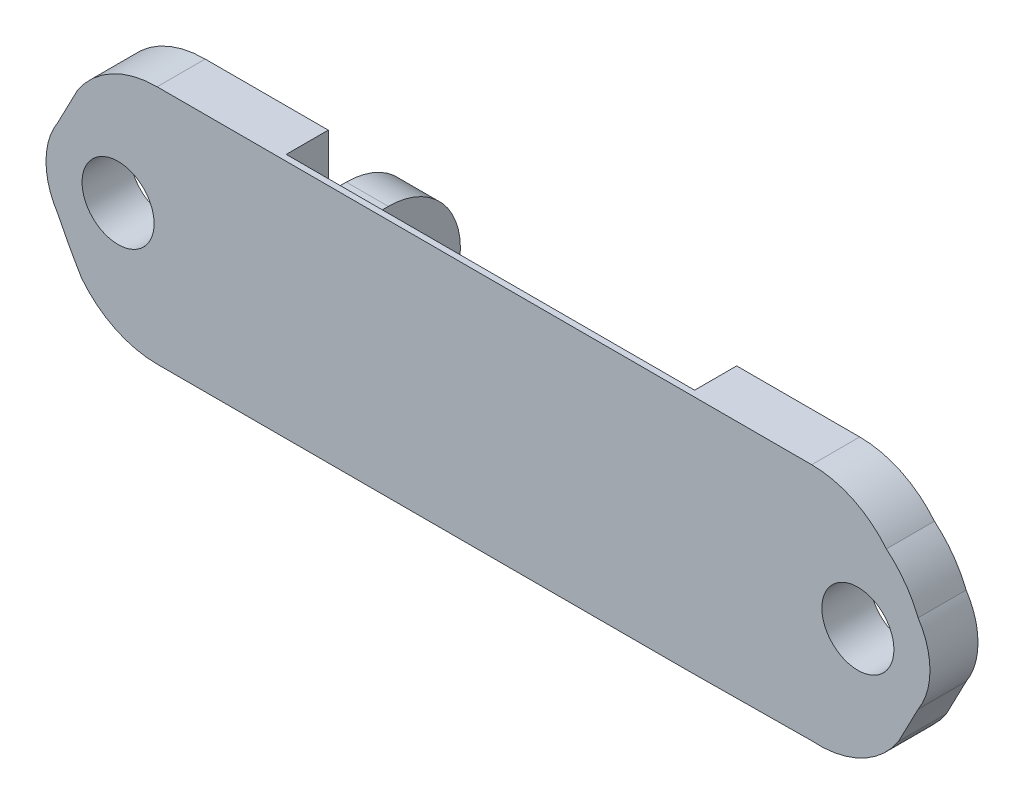
ISO-10303-21;
HEADER;
FILE_DESCRIPTION(('STEP AP214'),'2;1');
FILE_NAME('part.step','',(''),(''),'','','');
FILE_SCHEMA(('AUTOMOTIVE_DESIGN { 1 0 10303 214 1 1 1 1 }'));
ENDSEC;
DATA;
#1=APPLICATION_CONTEXT('core data for automotive mechanical design processes');
#2=APPLICATION_PROTOCOL_DEFINITION('international standard','automotive_design',2000,#1);
#3=PRODUCT_CONTEXT('',#1,'mechanical');
#4=PRODUCT('Part','Part','',(#3));
#5=PRODUCT_RELATED_PRODUCT_CATEGORY('part','',(#4));
#6=PRODUCT_DEFINITION_FORMATION('','',#4);
#7=PRODUCT_DEFINITION_CONTEXT('part definition',#1,'design');
#8=PRODUCT_DEFINITION('design','',#6,#7);
#9=PRODUCT_DEFINITION_SHAPE('','',#8);
#10=(LENGTH_UNIT() NAMED_UNIT(*) SI_UNIT(.MILLI.,.METRE.));
#11=(NAMED_UNIT(*) PLANE_ANGLE_UNIT() SI_UNIT($,.RADIAN.));
#12=(NAMED_UNIT(*) SI_UNIT($,.STERADIAN.) SOLID_ANGLE_UNIT());
#13=UNCERTAINTY_MEASURE_WITH_UNIT(LENGTH_MEASURE(1.E-05),#10,'distance_accuracy_value','');
#14=(GEOMETRIC_REPRESENTATION_CONTEXT(3) GLOBAL_UNCERTAINTY_ASSIGNED_CONTEXT((#13)) GLOBAL_UNIT_ASSIGNED_CONTEXT((#10,
#11,#12)) REPRESENTATION_CONTEXT('',''));
#15=CARTESIAN_POINT('',(0.,0.,0.));
#16=DIRECTION('',(0.,0.,1.));
#17=DIRECTION('',(1.,0.,0.));
#18=AXIS2_PLACEMENT_3D('',#15,#16,#17);
#19=CARTESIAN_POINT('',(-16.9999933862145,0.,4.));
#20=DIRECTION('',(1.,0.,0.));
#21=DIRECTION('',(0.,1.,0.));
#22=AXIS2_PLACEMENT_3D('',#19,#20,#21);
#23=PLANE('',#22);
#24=CARTESIAN_POINT('',(-16.9999933862145,-3.99999931575757,-6.00000102816619));
#25=DIRECTION('',(1.,0.,0.));
#26=DIRECTION('',(0.,0.,-1.));
#27=AXIS2_PLACEMENT_3D('',#24,#25,#26);
#28=CIRCLE('',#27,2.59999897183381);
#29=CARTESIAN_POINT('',(-16.9999933862145,-3.99999931575757,-8.6));
#30=VERTEX_POINT('',#29);
#31=EDGE_CURVE('E482',#30,#30,#28,.T.);
#32=ORIENTED_EDGE('',*,*,#31,.F.);
#33=EDGE_LOOP('',(#32));
#34=FACE_BOUND('',#33,.T.);
#35=DIRECTION('',(0.,-0.992631533391881,-0.121171939474797));
#36=VECTOR('',#35,1.);
#37=CARTESIAN_POINT('',(-16.9999933862145,-0.274222707120713,2.24641206074548));
#38=LINE('',#37,#36);
#39=CARTESIAN_POINT('',(-16.9999933862145,9.99999998281392,3.500601));
#40=VERTEX_POINT('',#39);
#41=CARTESIAN_POINT('',(-16.9999933862145,-2.29281201718889,1.99999999999999));
#42=VERTEX_POINT('',#41);
#43=EDGE_CURVE('E503',#40,#42,#38,.T.);
#44=ORIENTED_EDGE('',*,*,#43,.T.);
#45=DIRECTION('',(0.,-1.,0.));
#46=VECTOR('',#45,1.);
#47=CARTESIAN_POINT('',(-16.9999933862145,0.,1.99999999999999));
#48=LINE('',#47,#46);
#49=CARTESIAN_POINT('',(-16.9999933862145,-10.0000000171888,1.99999999999999));
#50=VERTEX_POINT('',#49);
#51=EDGE_CURVE('E283',#42,#50,#48,.T.);
#52=ORIENTED_EDGE('',*,*,#51,.T.);
#53=DIRECTION('',(0.,0.,-1.));
#54=VECTOR('',#53,1.);
#55=CARTESIAN_POINT('',(-16.9999933862145,-10.0000000171888,4.));
#56=LINE('',#55,#54);
#57=CARTESIAN_POINT('',(-16.9999933862145,-10.0000000171888,-4.99999929856876));
#58=VERTEX_POINT('',#57);
#59=EDGE_CURVE('E522',#50,#58,#56,.T.);
#60=ORIENTED_EDGE('',*,*,#59,.T.);
#61=CARTESIAN_POINT('',(-16.9999933862145,-3.99999931575757,-4.99999929856876));
#62=DIRECTION('',(1.,0.,0.));
#63=DIRECTION('',(0.,0.,-1.));
#64=AXIS2_PLACEMENT_3D('',#61,#62,#63);
#65=CIRCLE('',#64,6.00000070143124);
#66=CARTESIAN_POINT('',(-16.9999933862145,2.00000138567367,-4.99999929856876));
#67=VERTEX_POINT('',#66);
#68=EDGE_CURVE('E417',#58,#67,#65,.T.);
#69=ORIENTED_EDGE('',*,*,#68,.T.);
#70=DIRECTION('',(0.,0.,-1.));
#71=VECTOR('',#70,1.);
#72=CARTESIAN_POINT('',(-16.9999933862145,2.00000138567367,0.));
#73=LINE('',#72,#71);
#74=CARTESIAN_POINT('',(-16.9999933862145,2.00000138567367,0.));
#75=VERTEX_POINT('',#74);
#76=EDGE_CURVE('E412',#75,#67,#73,.T.);
#77=ORIENTED_EDGE('',*,*,#76,.F.);
#78=DIRECTION('',(0.,-1.,0.));
#79=VECTOR('',#78,1.);
#80=CARTESIAN_POINT('',(-16.9999933862145,0.,0.));
#81=LINE('',#80,#79);
#82=CARTESIAN_POINT('',(-16.9999933862145,9.99999998281392,0.));
#83=VERTEX_POINT('',#82);
#84=EDGE_CURVE('E393',#83,#75,#81,.T.);
#85=ORIENTED_EDGE('',*,*,#84,.F.);
#86=DIRECTION('',(0.,0.,-1.));
#87=VECTOR('',#86,1.);
#88=CARTESIAN_POINT('',(-16.9999933862145,9.99999998281392,4.));
#89=LINE('',#88,#87);
#90=EDGE_CURVE('E525',#40,#83,#89,.T.);
#91=ORIENTED_EDGE('',*,*,#90,.F.);
#92=EDGE_LOOP('',(#44,#52,#60,#69,#77,#85,#91));
#93=FACE_BOUND('',#92,.T.);
#94=ADVANCED_FACE('F36',(#34,#93),#23,.T.);
#95=CARTESIAN_POINT('',(0.,0.,0.));
#96=DIRECTION('',(0.,0.,1.));
#97=DIRECTION('',(1.,0.,0.));
#98=AXIS2_PLACEMENT_3D('',#95,#96,#97);
#99=PLANE('',#98);
#100=CARTESIAN_POINT('',(-30.5000467110804,-1.99999999981465E-06,0.));
#101=DIRECTION('',(0.,0.,1.));
#102=DIRECTION('',(1.,0.,0.));
#103=AXIS2_PLACEMENT_3D('',#100,#101,#102);
#104=CIRCLE('',#103,3.00002790263874);
#105=CARTESIAN_POINT('',(-27.5000188084417,-1.99999999981465E-06,0.));
#106=VERTEX_POINT('',#105);
#107=EDGE_CURVE('E363',#106,#106,#104,.T.);
#108=ORIENTED_EDGE('',*,*,#107,.T.);
#109=EDGE_LOOP('',(#108));
#110=FACE_BOUND('',#109,.T.);
#111=DIRECTION('',(1.,0.,0.));
#112=VECTOR('',#111,1.);
#113=CARTESIAN_POINT('',(-20.4999933862145,2.00000138567367,0.));
#114=LINE('',#113,#112);
#115=CARTESIAN_POINT('',(-20.4999933862145,2.00000138567367,0.));
#116=VERTEX_POINT('',#115);
#117=EDGE_CURVE('E370',#116,#75,#114,.T.);
#118=ORIENTED_EDGE('',*,*,#117,.F.);
#119=DIRECTION('',(0.,1.,0.));
#120=VECTOR('',#119,1.);
#121=CARTESIAN_POINT('',(-20.4999933862145,0.,0.));
#122=LINE('',#121,#120);
#123=CARTESIAN_POINT('',(-20.4999933862145,-10.0000000171888,0.));
#124=VERTEX_POINT('',#123);
#125=EDGE_CURVE('E394',#124,#116,#122,.T.);
#126=ORIENTED_EDGE('',*,*,#125,.F.);
#127=DIRECTION('',(1.,0.,0.));
#128=VECTOR('',#127,1.);
#129=CARTESIAN_POINT('',(0.,-10.0000000171888,0.));
#130=LINE('',#129,#128);
#131=CARTESIAN_POINT('',(-27.2459933862145,-10.0000000171888,0.));
#132=VERTEX_POINT('',#131);
#133=EDGE_CURVE('E384',#132,#124,#130,.T.);
#134=ORIENTED_EDGE('',*,*,#133,.F.);
#135=CARTESIAN_POINT('',(-27.2459933862145,-1.99998694505037,0.));
#136=DIRECTION('',(0.,0.,1.));
#137=DIRECTION('',(1.,0.,0.));
#138=AXIS2_PLACEMENT_3D('',#135,#136,#137);
#139=CIRCLE('',#138,8.00001307213843);
#140=CARTESIAN_POINT('',(-33.54048,-6.937562,0.));
#141=VERTEX_POINT('',#140);
#142=EDGE_CURVE('E378',#132,#141,#139,.F.);
#143=ORIENTED_EDGE('',*,*,#142,.T.);
#144=CARTESIAN_POINT('',(-35.515,-3.293894,0.));
#145=CARTESIAN_POINT('',(-34.6044389908926,-5.15695691780324,0.));
#146=CARTESIAN_POINT('',(-33.54048,-6.937562,0.));
#147=B_SPLINE_CURVE_WITH_KNOTS('',2,(#144,#145,#146),.UNSPECIFIED.,.F.,.F.,(3,3),(0.,1.),.UNSPECIFIED.);
#148=CARTESIAN_POINT('',(-35.515,-3.293894,0.));
#149=VERTEX_POINT('',#148);
#150=EDGE_CURVE('E373',#149,#141,#147,.T.);
#151=ORIENTED_EDGE('',*,*,#150,.F.);
#152=CARTESIAN_POINT('',(-30.5000467110804,-1.99999999981465E-06,0.));
#153=DIRECTION('',(0.,0.,1.));
#154=DIRECTION('',(1.,0.,0.));
#155=AXIS2_PLACEMENT_3D('',#152,#153,#154);
#156=CIRCLE('',#155,5.99995674965323);
#157=CARTESIAN_POINT('',(-35.515,3.29389,0.));
#158=VERTEX_POINT('',#157);
#159=EDGE_CURVE('E369',#158,#149,#156,.T.);
#160=ORIENTED_EDGE('',*,*,#159,.F.);
#161=CARTESIAN_POINT('',(-33.8759150000008,6.4362595,0.));
#162=CARTESIAN_POINT('',(-34.671605619201,4.85257254742909,0.));
#163=CARTESIAN_POINT('',(-35.515,3.29389,0.));
#164=B_SPLINE_CURVE_WITH_KNOTS('',2,(#161,#162,#163),.UNSPECIFIED.,.F.,.F.,(3,3),(0.,1.),.UNSPECIFIED.);
#165=CARTESIAN_POINT('',(-33.8759150000008,6.4362595,0.));
#166=VERTEX_POINT('',#165);
#167=EDGE_CURVE('E426',#166,#158,#164,.T.);
#168=ORIENTED_EDGE('',*,*,#167,.F.);
#169=CARTESIAN_POINT('',(-27.2665528840225,2.08928210255105,0.));
#170=DIRECTION('',(0.,0.,1.));
#171=DIRECTION('',(1.,0.,0.));
#172=AXIS2_PLACEMENT_3D('',#169,#170,#171);
#173=CIRCLE('',#172,7.91074459669005);
#174=CARTESIAN_POINT('',(-27.2459933862145,9.99999998281392,0.));
#175=VERTEX_POINT('',#174);
#176=EDGE_CURVE('E632',#175,#166,#173,.T.);
#177=ORIENTED_EDGE('',*,*,#176,.F.);
#178=DIRECTION('',(1.,0.,0.));
#179=VECTOR('',#178,1.);
#180=CARTESIAN_POINT('',(0.,9.99999998281392,0.));
#181=LINE('',#180,#179);
#182=EDGE_CURVE('E641',#175,#83,#181,.T.);
#183=ORIENTED_EDGE('',*,*,#182,.T.);
#184=ORIENTED_EDGE('',*,*,#84,.T.);
#185=EDGE_LOOP('',(#118,#126,#134,#143,#151,#160,#168,#177,#183,#184));
#186=FACE_BOUND('',#185,.T.);
#187=ADVANCED_FACE('F343',(#110,#186),#99,.F.);
#188=CARTESIAN_POINT('',(-30.5000467110804,-1.99999999981465E-06,4.));
#189=DIRECTION('',(0.,0.,-1.));
#190=DIRECTION('',(-1.,0.,0.));
#191=AXIS2_PLACEMENT_3D('',#188,#189,#190);
#192=CYLINDRICAL_SURFACE('',#191,5.99995674965323);
#193=ORIENTED_EDGE('',*,*,#159,.T.);
#194=DIRECTION('',(0.,0.,-1.));
#195=VECTOR('',#194,1.);
#196=CARTESIAN_POINT('',(-35.515,-3.293894,4.));
#197=LINE('',#196,#195);
#198=CARTESIAN_POINT('',(-35.515,-3.293894,4.));
#199=VERTEX_POINT('',#198);
#200=EDGE_CURVE('E11',#199,#149,#197,.T.);
#201=ORIENTED_EDGE('',*,*,#200,.F.);
#202=CARTESIAN_POINT('',(-30.5000467110804,-1.99999999981465E-06,4.));
#203=DIRECTION('',(0.,0.,1.));
#204=DIRECTION('',(1.,0.,0.));
#205=AXIS2_PLACEMENT_3D('',#202,#203,#204);
#206=CIRCLE('',#205,5.99995674965323);
#207=CARTESIAN_POINT('',(-35.515,3.29389,4.));
#208=VERTEX_POINT('',#207);
#209=EDGE_CURVE('E425',#208,#199,#206,.T.);
#210=ORIENTED_EDGE('',*,*,#209,.F.);
#211=DIRECTION('',(0.,0.,-1.));
#212=VECTOR('',#211,1.);
#213=CARTESIAN_POINT('',(-35.515,3.29389,4.));
#214=LINE('',#213,#212);
#215=EDGE_CURVE('E360',#208,#158,#214,.T.);
#216=ORIENTED_EDGE('',*,*,#215,.T.);
#217=EDGE_LOOP('',(#193,#201,#210,#216));
#218=FACE_BOUND('',#217,.T.);
#219=ADVANCED_FACE('F346',(#218),#192,.T.);
#220=CARTESIAN_POINT('',(-35.515,-3.293894,4.));
#221=CARTESIAN_POINT('',(-34.6044389908926,-5.15695691780324,4.));
#222=CARTESIAN_POINT('',(-33.54048,-6.937562,4.));
#223=B_SPLINE_CURVE_WITH_KNOTS('',2,(#220,#221,#222),.UNSPECIFIED.,.F.,.F.,(3,3),(0.,1.),.UNSPECIFIED.);
#224=DIRECTION('',(0.,0.,-1.));
#225=VECTOR('',#224,1.);
#226=SURFACE_OF_LINEAR_EXTRUSION('',#223,#225);
#227=ORIENTED_EDGE('',*,*,#150,.T.);
#228=DIRECTION('',(0.,0.,-1.));
#229=VECTOR('',#228,1.);
#230=CARTESIAN_POINT('',(-33.54048,-6.937562,4.));
#231=LINE('',#230,#229);
#232=CARTESIAN_POINT('',(-33.54048,-6.937562,4.));
#233=VERTEX_POINT('',#232);
#234=EDGE_CURVE('E46',#233,#141,#231,.T.);
#235=ORIENTED_EDGE('',*,*,#234,.F.);
#236=EDGE_CURVE('E429',#199,#233,#223,.T.);
#237=ORIENTED_EDGE('',*,*,#236,.F.);
#238=ORIENTED_EDGE('',*,*,#200,.T.);
#239=EDGE_LOOP('',(#227,#235,#237,#238));
#240=FACE_BOUND('',#239,.T.);
#241=ADVANCED_FACE('F440',(#240),#226,.F.);
#242=CARTESIAN_POINT('',(-27.2459933862145,-1.99998694505037,4.));
#243=DIRECTION('',(0.,0.,-1.));
#244=DIRECTION('',(-1.,0.,0.));
#245=AXIS2_PLACEMENT_3D('',#242,#243,#244);
#246=CYLINDRICAL_SURFACE('',#245,8.00001307213843);
#247=ORIENTED_EDGE('',*,*,#142,.F.);
#248=DIRECTION('',(0.,0.,-1.));
#249=VECTOR('',#248,1.);
#250=CARTESIAN_POINT('',(-27.2459933862145,-10.0000000171888,4.));
#251=LINE('',#250,#249);
#252=CARTESIAN_POINT('',(-27.2459933862145,-10.0000000171888,4.));
#253=VERTEX_POINT('',#252);
#254=EDGE_CURVE('E471',#253,#132,#251,.T.);
#255=ORIENTED_EDGE('',*,*,#254,.F.);
#256=CARTESIAN_POINT('',(-27.2459933862145,-1.99998694505037,4.));
#257=DIRECTION('',(0.,0.,1.));
#258=DIRECTION('',(1.,0.,0.));
#259=AXIS2_PLACEMENT_3D('',#256,#257,#258);
#260=CIRCLE('',#259,8.00001307213843);
#261=EDGE_CURVE('E434',#253,#233,#260,.F.);
#262=ORIENTED_EDGE('',*,*,#261,.T.);
#263=ORIENTED_EDGE('',*,*,#234,.T.);
#264=EDGE_LOOP('',(#247,#255,#262,#263));
#265=FACE_BOUND('',#264,.T.);
#266=ADVANCED_FACE('F443',(#265),#246,.T.);
#267=CARTESIAN_POINT('',(0.,-10.0000000171888,4.));
#268=DIRECTION('',(0.,1.,0.));
#269=DIRECTION('',(0.,0.,1.));
#270=AXIS2_PLACEMENT_3D('',#267,#268,#269);
#271=PLANE('',#270);
#272=ORIENTED_EDGE('',*,*,#133,.T.);
#273=DIRECTION('',(0.,0.,1.));
#274=VECTOR('',#273,1.);
#275=CARTESIAN_POINT('',(-20.4999933862145,-10.0000000171888,0.));
#276=LINE('',#275,#274);
#277=CARTESIAN_POINT('',(-20.4999933862145,-10.0000000171888,-4.99999929856876));
#278=VERTEX_POINT('',#277);
#279=EDGE_CURVE('E401',#278,#124,#276,.T.);
#280=ORIENTED_EDGE('',*,*,#279,.F.);
#281=DIRECTION('',(1.,0.,0.));
#282=VECTOR('',#281,1.);
#283=CARTESIAN_POINT('',(-20.4999933862145,-10.0000000171888,-4.99999929856876));
#284=LINE('',#283,#282);
#285=EDGE_CURVE('E397',#278,#58,#284,.T.);
#286=ORIENTED_EDGE('',*,*,#285,.T.);
#287=ORIENTED_EDGE('',*,*,#59,.F.);
#288=DIRECTION('',(-1.,0.,0.));
#289=VECTOR('',#288,1.);
#290=CARTESIAN_POINT('',(17.0000066137855,-10.0000000171888,1.99999999999999));
#291=LINE('',#290,#289);
#292=CARTESIAN_POINT('',(17.0000066137855,-10.0000000171888,1.99999999999999));
#293=VERTEX_POINT('',#292);
#294=EDGE_CURVE('E493',#293,#50,#291,.T.);
#295=ORIENTED_EDGE('',*,*,#294,.F.);
#296=DIRECTION('',(0.,0.,-1.));
#297=VECTOR('',#296,1.);
#298=CARTESIAN_POINT('',(17.0000066137855,-10.0000000171888,0.));
#299=LINE('',#298,#297);
#300=CARTESIAN_POINT('',(17.0000066137855,-10.0000000171888,4.));
#301=VERTEX_POINT('',#300);
#302=EDGE_CURVE('E508',#301,#293,#299,.T.);
#303=ORIENTED_EDGE('',*,*,#302,.F.);
#304=DIRECTION('',(1.,0.,0.));
#305=VECTOR('',#304,1.);
#306=CARTESIAN_POINT('',(0.,-10.0000000171888,4.));
#307=LINE('',#306,#305);
#308=EDGE_CURVE('E619',#253,#301,#307,.T.);
#309=ORIENTED_EDGE('',*,*,#308,.F.);
#310=ORIENTED_EDGE('',*,*,#254,.T.);
#311=EDGE_LOOP('',(#272,#280,#286,#287,#295,#303,#309,#310));
#312=FACE_BOUND('',#311,.T.);
#313=ADVANCED_FACE('F458',(#312),#271,.F.);
#314=CARTESIAN_POINT('',(0.,9.99999998281392,4.));
#315=DIRECTION('',(0.,1.,0.));
#316=DIRECTION('',(0.,0.,1.));
#317=AXIS2_PLACEMENT_3D('',#314,#315,#316);
#318=PLANE('',#317);
#319=ORIENTED_EDGE('',*,*,#182,.F.);
#320=DIRECTION('',(0.,0.,-1.));
#321=VECTOR('',#320,1.);
#322=CARTESIAN_POINT('',(-27.2459933862145,9.99999998281392,4.));
#323=LINE('',#322,#321);
#324=CARTESIAN_POINT('',(-27.2459933862145,9.99999998281392,4.));
#325=VERTEX_POINT('',#324);
#326=EDGE_CURVE('E634',#325,#175,#323,.T.);
#327=ORIENTED_EDGE('',*,*,#326,.F.);
#328=DIRECTION('',(1.,0.,0.));
#329=VECTOR('',#328,1.);
#330=CARTESIAN_POINT('',(0.,9.99999998281392,4.));
#331=LINE('',#330,#329);
#332=CARTESIAN_POINT('',(27.2460066137855,9.99999998281392,4.));
#333=VERTEX_POINT('',#332);
#334=EDGE_CURVE('E620',#325,#333,#331,.T.);
#335=ORIENTED_EDGE('',*,*,#334,.T.);
#336=DIRECTION('',(0.,0.,1.));
#337=VECTOR('',#336,1.);
#338=CARTESIAN_POINT('',(27.2460066137855,9.99999998281392,-28.3493348544401));
#339=LINE('',#338,#337);
#340=CARTESIAN_POINT('',(27.2460066137855,9.99999998281392,0.));
#341=VERTEX_POINT('',#340);
#342=EDGE_CURVE('E558',#341,#333,#339,.T.);
#343=ORIENTED_EDGE('',*,*,#342,.F.);
#344=DIRECTION('',(-1.,0.,0.));
#345=VECTOR('',#344,1.);
#346=CARTESIAN_POINT('',(0.,9.99999998281393,0.));
#347=LINE('',#346,#345);
#348=CARTESIAN_POINT('',(17.0000066137855,9.99999998281392,0.));
#349=VERTEX_POINT('',#348);
#350=EDGE_CURVE('E258',#341,#349,#347,.T.);
#351=ORIENTED_EDGE('',*,*,#350,.T.);
#352=DIRECTION('',(0.,0.,1.));
#353=VECTOR('',#352,1.);
#354=CARTESIAN_POINT('',(17.0000066137855,9.99999998281392,-28.3493348544401));
#355=LINE('',#354,#353);
#356=CARTESIAN_POINT('',(17.0000066137855,9.99999998281392,3.500601));
#357=VERTEX_POINT('',#356);
#358=EDGE_CURVE('E554',#349,#357,#355,.T.);
#359=ORIENTED_EDGE('',*,*,#358,.T.);
#360=DIRECTION('',(-1.,0.,0.));
#361=VECTOR('',#360,1.);
#362=CARTESIAN_POINT('',(17.0000066137855,9.99999998281392,3.500601));
#363=LINE('',#362,#361);
#364=EDGE_CURVE('E488',#357,#40,#363,.T.);
#365=ORIENTED_EDGE('',*,*,#364,.T.);
#366=ORIENTED_EDGE('',*,*,#90,.T.);
#367=EDGE_LOOP('',(#319,#327,#335,#343,#351,#359,#365,#366));
#368=FACE_BOUND('',#367,.T.);
#369=ADVANCED_FACE('F457',(#368),#318,.T.);
#370=CARTESIAN_POINT('',(-27.2665528840225,2.08928210255105,4.));
#371=DIRECTION('',(0.,0.,-1.));
#372=DIRECTION('',(-1.,0.,0.));
#373=AXIS2_PLACEMENT_3D('',#370,#371,#372);
#374=CYLINDRICAL_SURFACE('',#373,7.91074459669005);
#375=ORIENTED_EDGE('',*,*,#176,.T.);
#376=DIRECTION('',(0.,0.,-1.));
#377=VECTOR('',#376,1.);
#378=CARTESIAN_POINT('',(-33.8759150000008,6.4362595,4.));
#379=LINE('',#378,#377);
#380=CARTESIAN_POINT('',(-33.8759150000008,6.4362595,4.));
#381=VERTEX_POINT('',#380);
#382=EDGE_CURVE('E630',#381,#166,#379,.T.);
#383=ORIENTED_EDGE('',*,*,#382,.F.);
#384=CARTESIAN_POINT('',(-27.2665528840225,2.08928210255105,4.));
#385=DIRECTION('',(0.,0.,1.));
#386=DIRECTION('',(1.,0.,0.));
#387=AXIS2_PLACEMENT_3D('',#384,#385,#386);
#388=CIRCLE('',#387,7.91074459669005);
#389=EDGE_CURVE('E361',#325,#381,#388,.T.);
#390=ORIENTED_EDGE('',*,*,#389,.F.);
#391=ORIENTED_EDGE('',*,*,#326,.T.);
#392=EDGE_LOOP('',(#375,#383,#390,#391));
#393=FACE_BOUND('',#392,.T.);
#394=ADVANCED_FACE('F352',(#393),#374,.T.);
#395=CARTESIAN_POINT('',(-30.5000467110804,-1.99999999981465E-06,4.));
#396=DIRECTION('',(0.,0.,-1.));
#397=DIRECTION('',(-1.,0.,0.));
#398=AXIS2_PLACEMENT_3D('',#395,#396,#397);
#399=CYLINDRICAL_SURFACE('',#398,3.00002790263874);
#400=CARTESIAN_POINT('',(-30.5000467110804,-1.99999999981465E-06,4.));
#401=DIRECTION('',(0.,0.,1.));
#402=DIRECTION('',(1.,0.,0.));
#403=AXIS2_PLACEMENT_3D('',#400,#401,#402);
#404=CIRCLE('',#403,3.00002790263874);
#405=CARTESIAN_POINT('',(-27.5000188084417,-1.99999999981465E-06,4.));
#406=VERTEX_POINT('',#405);
#407=EDGE_CURVE('E422',#406,#406,#404,.T.);
#408=ORIENTED_EDGE('',*,*,#407,.T.);
#409=EDGE_LOOP('',(#408));
#410=FACE_BOUND('',#409,.T.);
#411=ORIENTED_EDGE('',*,*,#107,.F.);
#412=EDGE_LOOP('',(#411));
#413=FACE_BOUND('',#412,.T.);
#414=ADVANCED_FACE('F38',(#410,#413),#399,.F.);
#415=CARTESIAN_POINT('',(-33.8759150000008,6.4362595,4.));
#416=CARTESIAN_POINT('',(-34.671605619201,4.85257254742909,4.));
#417=CARTESIAN_POINT('',(-35.515,3.29389,4.));
#418=B_SPLINE_CURVE_WITH_KNOTS('',2,(#415,#416,#417),.UNSPECIFIED.,.F.,.F.,(3,3),(0.,1.),.UNSPECIFIED.);
#419=DIRECTION('',(0.,0.,-1.));
#420=VECTOR('',#419,1.);
#421=SURFACE_OF_LINEAR_EXTRUSION('',#418,#420);
#422=ORIENTED_EDGE('',*,*,#167,.T.);
#423=ORIENTED_EDGE('',*,*,#215,.F.);
#424=EDGE_CURVE('E354',#381,#208,#418,.T.);
#425=ORIENTED_EDGE('',*,*,#424,.F.);
#426=ORIENTED_EDGE('',*,*,#382,.T.);
#427=EDGE_LOOP('',(#422,#423,#425,#426));
#428=FACE_BOUND('',#427,.T.);
#429=ADVANCED_FACE('F341',(#428),#421,.F.);
#430=CARTESIAN_POINT('',(0.,0.,4.));
#431=DIRECTION('',(0.,0.,1.));
#432=DIRECTION('',(1.,0.,0.));
#433=AXIS2_PLACEMENT_3D('',#430,#431,#432);
#434=PLANE('',#433);
#435=ORIENTED_EDGE('',*,*,#407,.F.);
#436=EDGE_LOOP('',(#435));
#437=FACE_BOUND('',#436,.T.);
#438=ORIENTED_EDGE('',*,*,#209,.T.);
#439=ORIENTED_EDGE('',*,*,#236,.T.);
#440=ORIENTED_EDGE('',*,*,#261,.F.);
#441=ORIENTED_EDGE('',*,*,#308,.T.);
#442=DIRECTION('',(-0.999956948472392,-0.00927907332559516,0.));
#443=VECTOR('',#442,1.);
#444=CARTESIAN_POINT('',(0.0942504596323714,-10.156876521941,4.));
#445=LINE('',#444,#443);
#446=CARTESIAN_POINT('',(27.2460066137855,-9.90492253866407,4.));
#447=VERTEX_POINT('',#446);
#448=EDGE_CURVE('E584',#447,#301,#445,.T.);
#449=ORIENTED_EDGE('',*,*,#448,.F.);
#450=CARTESIAN_POINT('',(27.843667233727,-2.01678702655273,4.));
#451=DIRECTION('',(0.,0.,1.));
#452=DIRECTION('',(1.,0.,0.));
#453=AXIS2_PLACEMENT_3D('',#450,#451,#452);
#454=CIRCLE('',#453,7.91074459669005);
#455=CARTESIAN_POINT('',(34.4678266410245,-6.34118203866401,4.));
#456=VERTEX_POINT('',#455);
#457=EDGE_CURVE('E578',#447,#456,#454,.T.);
#458=ORIENTED_EDGE('',*,*,#457,.T.);
#459=CARTESIAN_POINT('',(34.4678266410245,-6.34118203866401,4.));
#460=CARTESIAN_POINT('',(35.2635172602257,-4.7574950860934,4.));
#461=CARTESIAN_POINT('',(36.1069116410244,-3.19881253866399,4.));
#462=B_SPLINE_CURVE_WITH_KNOTS('',2,(#459,#460,#461),.UNSPECIFIED.,.F.,.F.,(3,3),(0.,1.),.UNSPECIFIED.);
#463=CARTESIAN_POINT('',(36.1069116410244,-3.19881253866399,4.));
#464=VERTEX_POINT('',#463);
#465=EDGE_CURVE('E573',#456,#464,#462,.T.);
#466=ORIENTED_EDGE('',*,*,#465,.T.);
#467=CARTESIAN_POINT('',(31.0919583521048,0.0950794613359769,4.));
#468=DIRECTION('',(0.,0.,1.));
#469=DIRECTION('',(1.,0.,0.));
#470=AXIS2_PLACEMENT_3D('',#467,#468,#469);
#471=CIRCLE('',#470,5.99995674965323);
#472=CARTESIAN_POINT('',(36.1069116410244,3.38897146133602,4.));
#473=VERTEX_POINT('',#472);
#474=EDGE_CURVE('E604',#464,#473,#471,.T.);
#475=ORIENTED_EDGE('',*,*,#474,.T.);
#476=CARTESIAN_POINT('',(36.1069116410244,3.38897146133602,4.));
#477=CARTESIAN_POINT('',(35.2558734720784,5.53098412197611,4.));
#478=CARTESIAN_POINT('',(33.4647377913422,7.03263946133603,4.));
#479=B_SPLINE_CURVE_WITH_KNOTS('',2,(#476,#477,#478),.UNSPECIFIED.,.F.,.F.,(3,3),(0.,1.),.UNSPECIFIED.);
#480=CARTESIAN_POINT('',(33.4647377913422,7.03263946133603,4.));
#481=VERTEX_POINT('',#480);
#482=EDGE_CURVE('E606',#473,#481,#479,.T.);
#483=ORIENTED_EDGE('',*,*,#482,.T.);
#484=CARTESIAN_POINT('',(27.2460066137855,1.99998691067549,4.));
#485=DIRECTION('',(0.,0.,1.));
#486=DIRECTION('',(1.,0.,0.));
#487=AXIS2_PLACEMENT_3D('',#484,#485,#486);
#488=CIRCLE('',#487,8.00001307213843);
#489=EDGE_CURVE('E608',#333,#481,#488,.F.);
#490=ORIENTED_EDGE('',*,*,#489,.F.);
#491=ORIENTED_EDGE('',*,*,#334,.F.);
#492=ORIENTED_EDGE('',*,*,#389,.T.);
#493=ORIENTED_EDGE('',*,*,#424,.T.);
#494=EDGE_LOOP('',(#438,#439,#440,#441,#449,#458,#466,#475,#483,#490,#491,#492,#493));
#495=FACE_BOUND('',#494,.T.);
#496=CARTESIAN_POINT('',(31.0919583521048,0.0950794613359769,4.));
#497=DIRECTION('',(0.,0.,1.));
#498=DIRECTION('',(1.,0.,0.));
#499=AXIS2_PLACEMENT_3D('',#496,#497,#498);
#500=CIRCLE('',#499,3.00002790263876);
#501=CARTESIAN_POINT('',(34.0919862547436,0.0950794613359769,4.));
#502=VERTEX_POINT('',#501);
#503=EDGE_CURVE('E279',#502,#502,#500,.T.);
#504=ORIENTED_EDGE('',*,*,#503,.F.);
#505=EDGE_LOOP('',(#504));
#506=FACE_BOUND('',#505,.T.);
#507=ADVANCED_FACE('F331',(#437,#495,#506),#434,.T.);
#508=CARTESIAN_POINT('',(-20.4999933862145,2.00000138567367,0.));
#509=DIRECTION('',(0.,-1.,0.));
#510=DIRECTION('',(0.,0.,-1.));
#511=AXIS2_PLACEMENT_3D('',#508,#509,#510);
#512=PLANE('',#511);
#513=ORIENTED_EDGE('',*,*,#76,.T.);
#514=DIRECTION('',(1.,0.,0.));
#515=VECTOR('',#514,1.);
#516=CARTESIAN_POINT('',(-20.4999933862145,2.00000138567367,-4.99999929856876));
#517=LINE('',#516,#515);
#518=CARTESIAN_POINT('',(-20.4999933862145,2.00000138567367,-4.99999929856876));
#519=VERTEX_POINT('',#518);
#520=EDGE_CURVE('E411',#519,#67,#517,.T.);
#521=ORIENTED_EDGE('',*,*,#520,.F.);
#522=DIRECTION('',(0.,0.,-1.));
#523=VECTOR('',#522,1.);
#524=CARTESIAN_POINT('',(-20.4999933862145,2.00000138567367,0.));
#525=LINE('',#524,#523);
#526=EDGE_CURVE('E398',#116,#519,#525,.T.);
#527=ORIENTED_EDGE('',*,*,#526,.F.);
#528=ORIENTED_EDGE('',*,*,#117,.T.);
#529=EDGE_LOOP('',(#513,#521,#527,#528));
#530=FACE_BOUND('',#529,.T.);
#531=ADVANCED_FACE('F327',(#530),#512,.F.);
#532=CARTESIAN_POINT('',(-20.4999933862145,-3.99999931575757,-6.00000102816619));
#533=DIRECTION('',(1.,0.,0.));
#534=DIRECTION('',(0.,0.,-1.));
#535=AXIS2_PLACEMENT_3D('',#532,#533,#534);
#536=CYLINDRICAL_SURFACE('',#535,2.59999897183381);
#537=CARTESIAN_POINT('',(-20.4999933862145,-3.99999931575757,-6.00000102816619));
#538=DIRECTION('',(1.,0.,0.));
#539=DIRECTION('',(0.,0.,-1.));
#540=AXIS2_PLACEMENT_3D('',#537,#538,#539);
#541=CIRCLE('',#540,2.59999897183381);
#542=CARTESIAN_POINT('',(-20.4999933862145,-3.99999931575757,-8.6));
#543=VERTEX_POINT('',#542);
#544=EDGE_CURVE('E405',#543,#543,#541,.T.);
#545=ORIENTED_EDGE('',*,*,#544,.F.);
#546=EDGE_LOOP('',(#545));
#547=FACE_BOUND('',#546,.T.);
#548=ORIENTED_EDGE('',*,*,#31,.T.);
#549=EDGE_LOOP('',(#548));
#550=FACE_BOUND('',#549,.T.);
#551=ADVANCED_FACE('F330',(#547,#550),#536,.F.);
#552=CARTESIAN_POINT('',(-20.4999933862145,-3.99999931575757,-4.99999929856876));
#553=DIRECTION('',(1.,0.,0.));
#554=DIRECTION('',(0.,0.,-1.));
#555=AXIS2_PLACEMENT_3D('',#552,#553,#554);
#556=CYLINDRICAL_SURFACE('',#555,6.00000070143124);
#557=ORIENTED_EDGE('',*,*,#68,.F.);
#558=ORIENTED_EDGE('',*,*,#285,.F.);
#559=CARTESIAN_POINT('',(-20.4999933862145,-3.99999931575757,-4.99999929856876));
#560=DIRECTION('',(1.,0.,0.));
#561=DIRECTION('',(0.,0.,-1.));
#562=AXIS2_PLACEMENT_3D('',#559,#560,#561);
#563=CIRCLE('',#562,6.00000070143124);
#564=EDGE_CURVE('E404',#278,#519,#563,.T.);
#565=ORIENTED_EDGE('',*,*,#564,.T.);
#566=ORIENTED_EDGE('',*,*,#520,.T.);
#567=EDGE_LOOP('',(#557,#558,#565,#566));
#568=FACE_BOUND('',#567,.T.);
#569=ADVANCED_FACE('F325',(#568),#556,.T.);
#570=CARTESIAN_POINT('',(-20.4999933862145,0.,0.));
#571=DIRECTION('',(1.,0.,0.));
#572=DIRECTION('',(0.,0.,-1.));
#573=AXIS2_PLACEMENT_3D('',#570,#571,#572);
#574=PLANE('',#573);
#575=ORIENTED_EDGE('',*,*,#544,.T.);
#576=EDGE_LOOP('',(#575));
#577=FACE_BOUND('',#576,.T.);
#578=ORIENTED_EDGE('',*,*,#279,.T.);
#579=ORIENTED_EDGE('',*,*,#125,.T.);
#580=ORIENTED_EDGE('',*,*,#526,.T.);
#581=ORIENTED_EDGE('',*,*,#564,.F.);
#582=EDGE_LOOP('',(#578,#579,#580,#581));
#583=FACE_BOUND('',#582,.T.);
#584=ADVANCED_FACE('F321',(#577,#583),#574,.F.);
#585=CARTESIAN_POINT('',(17.0000066137855,0.,1.99999999999999));
#586=DIRECTION('',(0.,0.,-1.));
#587=DIRECTION('',(0.,1.,0.));
#588=AXIS2_PLACEMENT_3D('',#585,#586,#587);
#589=PLANE('',#588);
#590=ORIENTED_EDGE('',*,*,#51,.F.);
#591=DIRECTION('',(-1.,0.,0.));
#592=VECTOR('',#591,1.);
#593=CARTESIAN_POINT('',(17.0000066137855,-2.29281201718889,1.99999999999999));
#594=LINE('',#593,#592);
#595=CARTESIAN_POINT('',(17.0000066137855,-2.29281201718889,1.99999999999999));
#596=VERTEX_POINT('',#595);
#597=EDGE_CURVE('E484',#596,#42,#594,.T.);
#598=ORIENTED_EDGE('',*,*,#597,.F.);
#599=DIRECTION('',(0.,-1.,0.));
#600=VECTOR('',#599,1.);
#601=CARTESIAN_POINT('',(17.0000066137855,0.,1.99999999999999));
#602=LINE('',#601,#600);
#603=EDGE_CURVE('E40',#596,#293,#602,.T.);
#604=ORIENTED_EDGE('',*,*,#603,.T.);
#605=ORIENTED_EDGE('',*,*,#294,.T.);
#606=EDGE_LOOP('',(#590,#598,#604,#605));
#607=FACE_BOUND('',#606,.T.);
#608=ADVANCED_FACE('F317',(#607),#589,.T.);
#609=CARTESIAN_POINT('',(17.0000066137855,-0.274222707120713,2.24641206074548));
#610=DIRECTION('',(0.,0.121171939474797,-0.992631533391881));
#611=DIRECTION('',(0.,0.992631533391881,0.121171939474797));
#612=AXIS2_PLACEMENT_3D('',#609,#610,#611);
#613=PLANE('',#612);
#614=ORIENTED_EDGE('',*,*,#43,.F.);
#615=ORIENTED_EDGE('',*,*,#364,.F.);
#616=DIRECTION('',(0.,-0.992631533391881,-0.121171939474797));
#617=VECTOR('',#616,1.);
#618=CARTESIAN_POINT('',(17.0000066137855,-0.274222707120713,2.24641206074548));
#619=LINE('',#618,#617);
#620=EDGE_CURVE('E506',#357,#596,#619,.T.);
#621=ORIENTED_EDGE('',*,*,#620,.T.);
#622=ORIENTED_EDGE('',*,*,#597,.T.);
#623=EDGE_LOOP('',(#614,#615,#621,#622));
#624=FACE_BOUND('',#623,.T.);
#625=ADVANCED_FACE('F313',(#624),#613,.T.);
#626=CARTESIAN_POINT('',(31.0919583521048,0.0950794613359769,-28.3493348544401));
#627=DIRECTION('',(0.,0.,1.));
#628=DIRECTION('',(1.,0.,0.));
#629=AXIS2_PLACEMENT_3D('',#626,#627,#628);
#630=CYLINDRICAL_SURFACE('',#629,3.00002790263876);
#631=ORIENTED_EDGE('',*,*,#503,.T.);
#632=EDGE_LOOP('',(#631));
#633=FACE_BOUND('',#632,.T.);
#634=CARTESIAN_POINT('',(31.0919583521048,0.0950794613359769,0.));
#635=DIRECTION('',(0.,0.,-1.));
#636=DIRECTION('',(0.,1.,0.));
#637=AXIS2_PLACEMENT_3D('',#634,#635,#636);
#638=CIRCLE('',#637,3.00002790263876);
#639=CARTESIAN_POINT('',(31.0919583521048,3.09510736397474,0.));
#640=VERTEX_POINT('',#639);
#641=EDGE_CURVE('E280',#640,#640,#638,.F.);
#642=ORIENTED_EDGE('',*,*,#641,.F.);
#643=EDGE_LOOP('',(#642));
#644=FACE_BOUND('',#643,.T.);
#645=ADVANCED_FACE('F302',(#633,#644),#630,.F.);
#646=CARTESIAN_POINT('',(36.1069116410244,3.38897146133602,-28.3493348544401));
#647=CARTESIAN_POINT('',(35.2558734720784,5.53098412197611,-28.3493348544401));
#648=CARTESIAN_POINT('',(33.4647377913422,7.03263946133603,-28.3493348544401));
#649=B_SPLINE_CURVE_WITH_KNOTS('',2,(#646,#647,#648),.UNSPECIFIED.,.F.,.F.,(3,3),(0.,1.),.UNSPECIFIED.);
#650=DIRECTION('',(0.,0.,1.));
#651=VECTOR('',#650,1.);
#652=SURFACE_OF_LINEAR_EXTRUSION('',#649,#651);
#653=DIRECTION('',(0.,0.,1.));
#654=VECTOR('',#653,1.);
#655=CARTESIAN_POINT('',(36.1069116410244,3.38897146133602,-28.3493348544401));
#656=LINE('',#655,#654);
#657=CARTESIAN_POINT('',(36.1069116410244,3.38897146133602,0.));
#658=VERTEX_POINT('',#657);
#659=EDGE_CURVE('E572',#658,#473,#656,.T.);
#660=ORIENTED_EDGE('',*,*,#659,.F.);
#661=CARTESIAN_POINT('',(36.1069116410244,3.38897146133602,0.));
#662=CARTESIAN_POINT('',(35.2558734720784,5.53098412197611,0.));
#663=CARTESIAN_POINT('',(33.4647377913422,7.03263946133603,0.));
#664=B_SPLINE_CURVE_WITH_KNOTS('',2,(#661,#662,#663),.UNSPECIFIED.,.F.,.F.,(3,3),(0.,1.),.UNSPECIFIED.);
#665=CARTESIAN_POINT('',(33.4647377913422,7.03263946133603,0.));
#666=VERTEX_POINT('',#665);
#667=EDGE_CURVE('E284',#658,#666,#664,.T.);
#668=ORIENTED_EDGE('',*,*,#667,.T.);
#669=DIRECTION('',(0.,0.,1.));
#670=VECTOR('',#669,1.);
#671=CARTESIAN_POINT('',(33.4647377913422,7.03263946133603,-28.3493348544401));
#672=LINE('',#671,#670);
#673=EDGE_CURVE('E571',#666,#481,#672,.T.);
#674=ORIENTED_EDGE('',*,*,#673,.T.);
#675=ORIENTED_EDGE('',*,*,#482,.F.);
#676=EDGE_LOOP('',(#660,#668,#674,#675));
#677=FACE_BOUND('',#676,.T.);
#678=ADVANCED_FACE('F297',(#677),#652,.T.);
#679=CARTESIAN_POINT('',(27.2460066137855,1.99998691067549,-28.3493348544401));
#680=DIRECTION('',(0.,0.,1.));
#681=DIRECTION('',(1.,0.,0.));
#682=AXIS2_PLACEMENT_3D('',#679,#680,#681);
#683=CYLINDRICAL_SURFACE('',#682,8.00001307213843);
#684=CARTESIAN_POINT('',(27.2460066137855,1.99998691067549,0.));
#685=DIRECTION('',(0.,0.,-1.));
#686=DIRECTION('',(0.,1.,0.));
#687=AXIS2_PLACEMENT_3D('',#684,#685,#686);
#688=CIRCLE('',#687,8.00001307213843);
#689=EDGE_CURVE('E219',#341,#666,#688,.T.);
#690=ORIENTED_EDGE('',*,*,#689,.F.);
#691=ORIENTED_EDGE('',*,*,#342,.T.);
#692=ORIENTED_EDGE('',*,*,#489,.T.);
#693=ORIENTED_EDGE('',*,*,#673,.F.);
#694=EDGE_LOOP('',(#690,#691,#692,#693));
#695=FACE_BOUND('',#694,.T.);
#696=ADVANCED_FACE('F301',(#695),#683,.T.);
#697=CARTESIAN_POINT('',(17.0000066137855,0.,-28.3493348544401));
#698=DIRECTION('',(1.,0.,0.));
#699=DIRECTION('',(0.,0.,-1.));
#700=AXIS2_PLACEMENT_3D('',#697,#698,#699);
#701=PLANE('',#700);
#702=ORIENTED_EDGE('',*,*,#603,.F.);
#703=ORIENTED_EDGE('',*,*,#620,.F.);
#704=ORIENTED_EDGE('',*,*,#358,.F.);
#705=DIRECTION('',(0.,1.,0.));
#706=VECTOR('',#705,1.);
#707=CARTESIAN_POINT('',(17.0000066137855,0.,0.));
#708=LINE('',#707,#706);
#709=CARTESIAN_POINT('',(17.0000066137855,1.98580142953808,0.));
#710=VERTEX_POINT('',#709);
#711=EDGE_CURVE('E261',#710,#349,#708,.T.);
#712=ORIENTED_EDGE('',*,*,#711,.F.);
#713=DIRECTION('',(0.,0.,-1.));
#714=VECTOR('',#713,1.);
#715=CARTESIAN_POINT('',(17.0000066137855,1.98580142953808,0.));
#716=LINE('',#715,#714);
#717=CARTESIAN_POINT('',(17.0000066137855,1.98580142953808,-4.99999929856876));
#718=VERTEX_POINT('',#717);
#719=EDGE_CURVE('E249',#710,#718,#716,.T.);
#720=ORIENTED_EDGE('',*,*,#719,.T.);
#721=CARTESIAN_POINT('',(17.0000066137855,-4.01419927189317,-4.99999929856876));
#722=DIRECTION('',(1.,0.,0.));
#723=DIRECTION('',(0.,0.,-1.));
#724=AXIS2_PLACEMENT_3D('',#721,#722,#723);
#725=CIRCLE('',#724,6.00000070143124);
#726=CARTESIAN_POINT('',(17.0000066137855,-10.0141999733244,-4.99999929856876));
#727=VERTEX_POINT('',#726);
#728=EDGE_CURVE('E247',#727,#718,#725,.T.);
#729=ORIENTED_EDGE('',*,*,#728,.F.);
#730=DIRECTION('',(0.,0.,1.));
#731=VECTOR('',#730,1.);
#732=CARTESIAN_POINT('',(17.0000066137855,-10.0141999733244,0.));
#733=LINE('',#732,#731);
#734=CARTESIAN_POINT('',(17.0000066137855,-10.0141999733244,0.));
#735=VERTEX_POINT('',#734);
#736=EDGE_CURVE('E215',#727,#735,#733,.T.);
#737=ORIENTED_EDGE('',*,*,#736,.T.);
#738=DIRECTION('',(0.,-1.,0.));
#739=VECTOR('',#738,1.);
#740=CARTESIAN_POINT('',(17.0000066137855,0.,0.));
#741=LINE('',#740,#739);
#742=CARTESIAN_POINT('',(17.0000066137855,-10.0000000171888,0.));
#743=VERTEX_POINT('',#742);
#744=EDGE_CURVE('E237',#743,#735,#741,.T.);
#745=ORIENTED_EDGE('',*,*,#744,.F.);
#746=DIRECTION('',(0.,0.,1.));
#747=VECTOR('',#746,1.);
#748=CARTESIAN_POINT('',(17.0000066137855,-10.0000000171888,-28.3493348544401));
#749=LINE('',#748,#747);
#750=EDGE_CURVE('E552',#743,#293,#749,.T.);
#751=ORIENTED_EDGE('',*,*,#750,.T.);
#752=EDGE_LOOP('',(#702,#703,#704,#712,#720,#729,#737,#745,#751));
#753=FACE_BOUND('',#752,.T.);
#754=CARTESIAN_POINT('',(17.0000066137855,-4.01419927189317,-6.00000102816619));
#755=DIRECTION('',(1.,0.,0.));
#756=DIRECTION('',(0.,0.,-1.));
#757=AXIS2_PLACEMENT_3D('',#754,#755,#756);
#758=CIRCLE('',#757,2.59999897183381);
#759=CARTESIAN_POINT('',(17.0000066137855,-4.01419927189317,-8.6));
#760=VERTEX_POINT('',#759);
#761=EDGE_CURVE('E243',#760,#760,#758,.T.);
#762=ORIENTED_EDGE('',*,*,#761,.T.);
#763=EDGE_LOOP('',(#762));
#764=FACE_BOUND('',#763,.T.);
#765=ADVANCED_FACE('F547',(#753,#764),#701,.F.);
#766=CARTESIAN_POINT('',(0.0942504596323714,-10.156876521941,-28.3493348544401));
#767=DIRECTION('',(-0.00927907332559516,0.999956948472392,0.));
#768=DIRECTION('',(-0.999956948472392,-0.00927907332559516,0.));
#769=AXIS2_PLACEMENT_3D('',#766,#767,#768);
#770=PLANE('',#769);
#771=DIRECTION('',(-0.999956948472392,-0.00927907332559516,0.));
#772=VECTOR('',#771,1.);
#773=CARTESIAN_POINT('',(0.0942504596323714,-10.156876521941,0.));
#774=LINE('',#773,#772);
#775=CARTESIAN_POINT('',(27.2460066137855,-9.90492253866407,0.));
#776=VERTEX_POINT('',#775);
#777=CARTESIAN_POINT('',(20.5000066137855,-9.96752186231504,0.));
#778=VERTEX_POINT('',#777);
#779=EDGE_CURVE('E263',#776,#778,#774,.T.);
#780=ORIENTED_EDGE('',*,*,#779,.F.);
#781=DIRECTION('',(0.,0.,1.));
#782=VECTOR('',#781,1.);
#783=CARTESIAN_POINT('',(27.2460066137855,-9.90492253866407,-28.3493348544401));
#784=LINE('',#783,#782);
#785=EDGE_CURVE('E553',#776,#447,#784,.T.);
#786=ORIENTED_EDGE('',*,*,#785,.T.);
#787=ORIENTED_EDGE('',*,*,#448,.T.);
#788=ORIENTED_EDGE('',*,*,#302,.T.);
#789=ORIENTED_EDGE('',*,*,#750,.F.);
#790=EDGE_CURVE('E62',#778,#743,#774,.T.);
#791=ORIENTED_EDGE('',*,*,#790,.F.);
#792=EDGE_LOOP('',(#780,#786,#787,#788,#789,#791));
#793=FACE_BOUND('',#792,.T.);
#794=ADVANCED_FACE('F618',(#793),#770,.F.);
#795=CARTESIAN_POINT('',(27.843667233727,-2.01678702655273,-28.3493348544401));
#796=DIRECTION('',(0.,0.,1.));
#797=DIRECTION('',(1.,0.,0.));
#798=AXIS2_PLACEMENT_3D('',#795,#796,#797);
#799=CYLINDRICAL_SURFACE('',#798,7.91074459669005);
#800=ORIENTED_EDGE('',*,*,#785,.F.);
#801=CARTESIAN_POINT('',(27.843667233727,-2.01678702655273,0.));
#802=DIRECTION('',(0.,0.,-1.));
#803=DIRECTION('',(0.,1.,0.));
#804=AXIS2_PLACEMENT_3D('',#801,#802,#803);
#805=CIRCLE('',#804,7.91074459669005);
#806=CARTESIAN_POINT('',(34.4678266410245,-6.34118203866401,0.));
#807=VERTEX_POINT('',#806);
#808=EDGE_CURVE('E265',#776,#807,#805,.F.);
#809=ORIENTED_EDGE('',*,*,#808,.T.);
#810=DIRECTION('',(0.,0.,1.));
#811=VECTOR('',#810,1.);
#812=CARTESIAN_POINT('',(34.4678266410245,-6.34118203866401,-28.3493348544401));
#813=LINE('',#812,#811);
#814=EDGE_CURVE('E556',#807,#456,#813,.T.);
#815=ORIENTED_EDGE('',*,*,#814,.T.);
#816=ORIENTED_EDGE('',*,*,#457,.F.);
#817=EDGE_LOOP('',(#800,#809,#815,#816));
#818=FACE_BOUND('',#817,.T.);
#819=ADVANCED_FACE('F598',(#818),#799,.T.);
#820=CARTESIAN_POINT('',(34.4678266410245,-6.34118203866401,-28.3493348544401));
#821=CARTESIAN_POINT('',(35.2635172602257,-4.7574950860934,-28.3493348544401));
#822=CARTESIAN_POINT('',(36.1069116410244,-3.19881253866399,-28.3493348544401));
#823=B_SPLINE_CURVE_WITH_KNOTS('',2,(#820,#821,#822),.UNSPECIFIED.,.F.,.F.,(3,3),(0.,1.),.UNSPECIFIED.);
#824=DIRECTION('',(0.,0.,1.));
#825=VECTOR('',#824,1.);
#826=SURFACE_OF_LINEAR_EXTRUSION('',#823,#825);
#827=ORIENTED_EDGE('',*,*,#814,.F.);
#828=CARTESIAN_POINT('',(34.4678266410245,-6.34118203866401,0.));
#829=CARTESIAN_POINT('',(35.2635172602257,-4.7574950860934,0.));
#830=CARTESIAN_POINT('',(36.1069116410244,-3.19881253866399,0.));
#831=B_SPLINE_CURVE_WITH_KNOTS('',2,(#828,#829,#830),.UNSPECIFIED.,.F.,.F.,(3,3),(0.,1.),.UNSPECIFIED.);
#832=CARTESIAN_POINT('',(36.1069116410244,-3.19881253866399,0.));
#833=VERTEX_POINT('',#832);
#834=EDGE_CURVE('E268',#807,#833,#831,.T.);
#835=ORIENTED_EDGE('',*,*,#834,.T.);
#836=DIRECTION('',(0.,0.,1.));
#837=VECTOR('',#836,1.);
#838=CARTESIAN_POINT('',(36.1069116410244,-3.19881253866399,-28.3493348544401));
#839=LINE('',#838,#837);
#840=EDGE_CURVE('E590',#833,#464,#839,.T.);
#841=ORIENTED_EDGE('',*,*,#840,.T.);
#842=ORIENTED_EDGE('',*,*,#465,.F.);
#843=EDGE_LOOP('',(#827,#835,#841,#842));
#844=FACE_BOUND('',#843,.T.);
#845=ADVANCED_FACE('F309',(#844),#826,.T.);
#846=CARTESIAN_POINT('',(31.0919583521048,0.0950794613359769,-28.3493348544401));
#847=DIRECTION('',(0.,0.,1.));
#848=DIRECTION('',(1.,0.,0.));
#849=AXIS2_PLACEMENT_3D('',#846,#847,#848);
#850=CYLINDRICAL_SURFACE('',#849,5.99995674965323);
#851=ORIENTED_EDGE('',*,*,#840,.F.);
#852=CARTESIAN_POINT('',(31.0919583521048,0.0950794613359769,0.));
#853=DIRECTION('',(0.,0.,-1.));
#854=DIRECTION('',(0.,1.,0.));
#855=AXIS2_PLACEMENT_3D('',#852,#853,#854);
#856=CIRCLE('',#855,5.99995674965323);
#857=EDGE_CURVE('E273',#833,#658,#856,.F.);
#858=ORIENTED_EDGE('',*,*,#857,.T.);
#859=ORIENTED_EDGE('',*,*,#659,.T.);
#860=ORIENTED_EDGE('',*,*,#474,.F.);
#861=EDGE_LOOP('',(#851,#858,#859,#860));
#862=FACE_BOUND('',#861,.T.);
#863=ADVANCED_FACE('F305',(#862),#850,.T.);
#864=CARTESIAN_POINT('',(20.5000066137855,0.,0.));
#865=DIRECTION('',(0.,0.,-1.));
#866=DIRECTION('',(0.,1.,0.));
#867=AXIS2_PLACEMENT_3D('',#864,#865,#866);
#868=PLANE('',#867);
#869=DIRECTION('',(-1.,0.,0.));
#870=VECTOR('',#869,1.);
#871=CARTESIAN_POINT('',(20.5000066137855,1.98580142953808,0.));
#872=LINE('',#871,#870);
#873=CARTESIAN_POINT('',(20.5000066137855,1.98580142953808,0.));
#874=VERTEX_POINT('',#873);
#875=EDGE_CURVE('E254',#874,#710,#872,.T.);
#876=ORIENTED_EDGE('',*,*,#875,.T.);
#877=ORIENTED_EDGE('',*,*,#711,.T.);
#878=ORIENTED_EDGE('',*,*,#350,.F.);
#879=ORIENTED_EDGE('',*,*,#689,.T.);
#880=ORIENTED_EDGE('',*,*,#667,.F.);
#881=ORIENTED_EDGE('',*,*,#857,.F.);
#882=ORIENTED_EDGE('',*,*,#834,.F.);
#883=ORIENTED_EDGE('',*,*,#808,.F.);
#884=ORIENTED_EDGE('',*,*,#779,.T.);
#885=DIRECTION('',(0.,-1.,0.));
#886=VECTOR('',#885,1.);
#887=CARTESIAN_POINT('',(20.5000066137855,0.,0.));
#888=LINE('',#887,#886);
#889=EDGE_CURVE('E54',#874,#778,#888,.T.);
#890=ORIENTED_EDGE('',*,*,#889,.F.);
#891=EDGE_LOOP('',(#876,#877,#878,#879,#880,#881,#882,#883,#884,#890));
#892=FACE_BOUND('',#891,.T.);
#893=ORIENTED_EDGE('',*,*,#641,.T.);
#894=EDGE_LOOP('',(#893));
#895=FACE_BOUND('',#894,.T.);
#896=ADVANCED_FACE('F308',(#892,#895),#868,.T.);
#897=CARTESIAN_POINT('',(20.5000066137855,0.,0.));
#898=DIRECTION('',(0.,0.,-1.));
#899=DIRECTION('',(0.,1.,0.));
#900=AXIS2_PLACEMENT_3D('',#897,#898,#899);
#901=PLANE('',#900);
#902=CARTESIAN_POINT('',(20.5000066137855,-10.0141999733244,0.));
#903=VERTEX_POINT('',#902);
#904=EDGE_CURVE('E232',#778,#903,#888,.T.);
#905=ORIENTED_EDGE('',*,*,#904,.F.);
#906=ORIENTED_EDGE('',*,*,#790,.T.);
#907=ORIENTED_EDGE('',*,*,#744,.T.);
#908=DIRECTION('',(-1.,0.,0.));
#909=VECTOR('',#908,1.);
#910=CARTESIAN_POINT('',(20.5000066137855,-10.0141999733244,0.));
#911=LINE('',#910,#909);
#912=EDGE_CURVE('E242',#903,#735,#911,.T.);
#913=ORIENTED_EDGE('',*,*,#912,.F.);
#914=EDGE_LOOP('',(#905,#906,#907,#913));
#915=FACE_BOUND('',#914,.T.);
#916=ADVANCED_FACE('F664',(#915),#901,.F.);
#917=CARTESIAN_POINT('',(20.5000066137855,-10.0141999733244,0.));
#918=DIRECTION('',(0.,-1.,0.));
#919=DIRECTION('',(0.,0.,-1.));
#920=AXIS2_PLACEMENT_3D('',#917,#918,#919);
#921=PLANE('',#920);
#922=ORIENTED_EDGE('',*,*,#736,.F.);
#923=DIRECTION('',(-1.,0.,0.));
#924=VECTOR('',#923,1.);
#925=CARTESIAN_POINT('',(20.5000066137855,-10.0141999733244,-4.99999929856876));
#926=LINE('',#925,#924);
#927=CARTESIAN_POINT('',(20.5000066137855,-10.0141999733244,-4.99999929856876));
#928=VERTEX_POINT('',#927);
#929=EDGE_CURVE('E208',#928,#727,#926,.T.);
#930=ORIENTED_EDGE('',*,*,#929,.F.);
#931=DIRECTION('',(0.,0.,1.));
#932=VECTOR('',#931,1.);
#933=CARTESIAN_POINT('',(20.5000066137855,-10.0141999733244,0.));
#934=LINE('',#933,#932);
#935=EDGE_CURVE('E213',#928,#903,#934,.T.);
#936=ORIENTED_EDGE('',*,*,#935,.T.);
#937=ORIENTED_EDGE('',*,*,#912,.T.);
#938=EDGE_LOOP('',(#922,#930,#936,#937));
#939=FACE_BOUND('',#938,.T.);
#940=ADVANCED_FACE('F210',(#939),#921,.T.);
#941=CARTESIAN_POINT('',(20.5000066137855,-4.01419927189317,-4.99999929856876));
#942=DIRECTION('',(-1.,0.,0.));
#943=DIRECTION('',(0.,0.,1.));
#944=AXIS2_PLACEMENT_3D('',#941,#942,#943);
#945=CYLINDRICAL_SURFACE('',#944,6.00000070143124);
#946=ORIENTED_EDGE('',*,*,#728,.T.);
#947=DIRECTION('',(-1.,0.,0.));
#948=VECTOR('',#947,1.);
#949=CARTESIAN_POINT('',(20.5000066137855,1.98580142953808,-4.99999929856876));
#950=LINE('',#949,#948);
#951=CARTESIAN_POINT('',(20.5000066137855,1.98580142953808,-4.99999929856876));
#952=VERTEX_POINT('',#951);
#953=EDGE_CURVE('E220',#952,#718,#950,.T.);
#954=ORIENTED_EDGE('',*,*,#953,.F.);
#955=CARTESIAN_POINT('',(20.5000066137855,-4.01419927189317,-4.99999929856876));
#956=DIRECTION('',(1.,0.,0.));
#957=DIRECTION('',(0.,0.,-1.));
#958=AXIS2_PLACEMENT_3D('',#955,#956,#957);
#959=CIRCLE('',#958,6.00000070143124);
#960=EDGE_CURVE('E223',#928,#952,#959,.T.);
#961=ORIENTED_EDGE('',*,*,#960,.F.);
#962=ORIENTED_EDGE('',*,*,#929,.T.);
#963=EDGE_LOOP('',(#946,#954,#961,#962));
#964=FACE_BOUND('',#963,.T.);
#965=ADVANCED_FACE('F224',(#964),#945,.T.);
#966=CARTESIAN_POINT('',(20.5000066137855,1.98580142953808,0.));
#967=DIRECTION('',(0.,1.,0.));
#968=DIRECTION('',(0.,0.,1.));
#969=AXIS2_PLACEMENT_3D('',#966,#967,#968);
#970=PLANE('',#969);
#971=ORIENTED_EDGE('',*,*,#719,.F.);
#972=ORIENTED_EDGE('',*,*,#875,.F.);
#973=DIRECTION('',(0.,0.,-1.));
#974=VECTOR('',#973,1.);
#975=CARTESIAN_POINT('',(20.5000066137855,1.98580142953808,0.));
#976=LINE('',#975,#974);
#977=EDGE_CURVE('E228',#874,#952,#976,.T.);
#978=ORIENTED_EDGE('',*,*,#977,.T.);
#979=ORIENTED_EDGE('',*,*,#953,.T.);
#980=EDGE_LOOP('',(#971,#972,#978,#979));
#981=FACE_BOUND('',#980,.T.);
#982=ADVANCED_FACE('F652',(#981),#970,.T.);
#983=CARTESIAN_POINT('',(20.5000066137855,-4.01419927189317,-6.00000102816619));
#984=DIRECTION('',(-1.,0.,0.));
#985=DIRECTION('',(0.,0.,1.));
#986=AXIS2_PLACEMENT_3D('',#983,#984,#985);
#987=CYLINDRICAL_SURFACE('',#986,2.59999897183381);
#988=CARTESIAN_POINT('',(20.5000066137855,-4.01419927189317,-6.00000102816619));
#989=DIRECTION('',(1.,0.,0.));
#990=DIRECTION('',(0.,0.,-1.));
#991=AXIS2_PLACEMENT_3D('',#988,#989,#990);
#992=CIRCLE('',#991,2.59999897183381);
#993=CARTESIAN_POINT('',(20.5000066137855,-4.01419927189317,-8.6));
#994=VERTEX_POINT('',#993);
#995=EDGE_CURVE('E234',#994,#994,#992,.T.);
#996=ORIENTED_EDGE('',*,*,#995,.T.);
#997=EDGE_LOOP('',(#996));
#998=FACE_BOUND('',#997,.T.);
#999=ORIENTED_EDGE('',*,*,#761,.F.);
#1000=EDGE_LOOP('',(#999));
#1001=FACE_BOUND('',#1000,.T.);
#1002=ADVANCED_FACE('F654',(#998,#1001),#987,.F.);
#1003=CARTESIAN_POINT('',(20.5000066137855,0.,0.));
#1004=DIRECTION('',(1.,0.,0.));
#1005=DIRECTION('',(0.,0.,-1.));
#1006=AXIS2_PLACEMENT_3D('',#1003,#1004,#1005);
#1007=PLANE('',#1006);
#1008=ORIENTED_EDGE('',*,*,#995,.F.);
#1009=EDGE_LOOP('',(#1008));
#1010=FACE_BOUND('',#1009,.T.);
#1011=ORIENTED_EDGE('',*,*,#935,.F.);
#1012=ORIENTED_EDGE('',*,*,#960,.T.);
#1013=ORIENTED_EDGE('',*,*,#977,.F.);
#1014=ORIENTED_EDGE('',*,*,#889,.T.);
#1015=ORIENTED_EDGE('',*,*,#904,.T.);
#1016=EDGE_LOOP('',(#1011,#1012,#1013,#1014,#1015));
#1017=FACE_BOUND('',#1016,.T.);
#1018=ADVANCED_FACE('F230',(#1010,#1017),#1007,.T.);
#1019=CLOSED_SHELL('',(#94,#187,#219,#241,#266,#313,#369,#394,#414,#429,#507,#531,#551,#569,
#584,#608,#625,#645,#678,#696,#765,#794,#819,#845,#863,#896,#916,#940,#965,#982,#1002,#1018));
#1020=MANIFOLD_SOLID_BREP('B2',#1019);
#1021=ADVANCED_BREP_SHAPE_REPRESENTATION('',(#18,#1020),#14);
#1022=SHAPE_DEFINITION_REPRESENTATION(#9,#1021);
ENDSEC;
END-ISO-10303-21;
